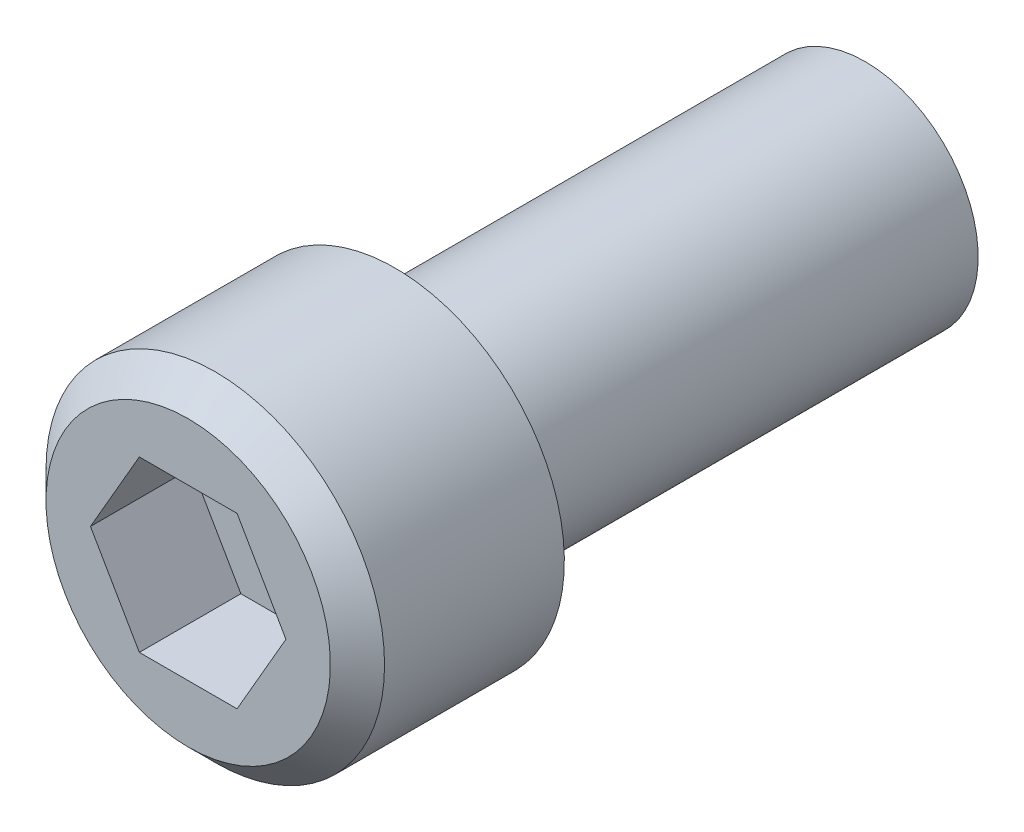
ISO-10303-21;
HEADER;
FILE_DESCRIPTION(('STEP AP214'),'2;1');
FILE_NAME('part.step','',(''),(''),'','','');
FILE_SCHEMA(('AUTOMOTIVE_DESIGN { 1 0 10303 214 1 1 1 1 }'));
ENDSEC;
DATA;
#1=APPLICATION_CONTEXT('core data for automotive mechanical design processes');
#2=APPLICATION_PROTOCOL_DEFINITION('international standard','automotive_design',2000,#1);
#3=PRODUCT_CONTEXT('',#1,'mechanical');
#4=PRODUCT('Part','Part','',(#3));
#5=PRODUCT_RELATED_PRODUCT_CATEGORY('part','',(#4));
#6=PRODUCT_DEFINITION_FORMATION('','',#4);
#7=PRODUCT_DEFINITION_CONTEXT('part definition',#1,'design');
#8=PRODUCT_DEFINITION('design','',#6,#7);
#9=PRODUCT_DEFINITION_SHAPE('','',#8);
#10=(LENGTH_UNIT() NAMED_UNIT(*) SI_UNIT(.MILLI.,.METRE.));
#11=(NAMED_UNIT(*) PLANE_ANGLE_UNIT() SI_UNIT($,.RADIAN.));
#12=(NAMED_UNIT(*) SI_UNIT($,.STERADIAN.) SOLID_ANGLE_UNIT());
#13=UNCERTAINTY_MEASURE_WITH_UNIT(LENGTH_MEASURE(1.E-05),#10,'distance_accuracy_value','');
#14=(GEOMETRIC_REPRESENTATION_CONTEXT(3) GLOBAL_UNCERTAINTY_ASSIGNED_CONTEXT((#13)) GLOBAL_UNIT_ASSIGNED_CONTEXT((#10,
#11,#12)) REPRESENTATION_CONTEXT('',''));
#15=CARTESIAN_POINT('',(0.,0.,0.));
#16=DIRECTION('',(0.,0.,1.));
#17=DIRECTION('',(1.,0.,0.));
#18=AXIS2_PLACEMENT_3D('',#15,#16,#17);
#19=CARTESIAN_POINT('',(0.,0.,0.));
#20=DIRECTION('',(0.,0.,-1.));
#21=DIRECTION('',(0.,1.,0.));
#22=AXIS2_PLACEMENT_3D('',#19,#20,#21);
#23=PLANE('',#22);
#24=DIRECTION('',(-0.5,0.866025403784438,0.));
#25=VECTOR('',#24,1.);
#26=CARTESIAN_POINT('',(2.59807621135332,0.,0.));
#27=LINE('',#26,#25);
#28=CARTESIAN_POINT('',(2.59807621135331,0.,0.));
#29=VERTEX_POINT('',#28);
#30=CARTESIAN_POINT('',(1.29903810567666,2.25,0.));
#31=VERTEX_POINT('',#30);
#32=EDGE_CURVE('E127',#29,#31,#27,.T.);
#33=ORIENTED_EDGE('',*,*,#32,.F.);
#34=DIRECTION('',(0.499999999999999,0.866025403784439,0.));
#35=VECTOR('',#34,1.);
#36=CARTESIAN_POINT('',(1.29903810567666,-2.25,0.));
#37=LINE('',#36,#35);
#38=CARTESIAN_POINT('',(1.29903810567666,-2.25,0.));
#39=VERTEX_POINT('',#38);
#40=EDGE_CURVE('E53',#39,#29,#37,.T.);
#41=ORIENTED_EDGE('',*,*,#40,.F.);
#42=DIRECTION('',(1.,0.,0.));
#43=VECTOR('',#42,1.);
#44=CARTESIAN_POINT('',(-1.29903810567666,-2.25,0.));
#45=LINE('',#44,#43);
#46=CARTESIAN_POINT('',(-1.29903810567666,-2.25,0.));
#47=VERTEX_POINT('',#46);
#48=EDGE_CURVE('E136',#47,#39,#45,.T.);
#49=ORIENTED_EDGE('',*,*,#48,.F.);
#50=DIRECTION('',(0.5,-0.866025403784438,0.));
#51=VECTOR('',#50,1.);
#52=CARTESIAN_POINT('',(-2.59807621135331,0.,0.));
#53=LINE('',#52,#51);
#54=CARTESIAN_POINT('',(-2.59807621135331,0.,0.));
#55=VERTEX_POINT('',#54);
#56=EDGE_CURVE('E134',#55,#47,#53,.T.);
#57=ORIENTED_EDGE('',*,*,#56,.F.);
#58=DIRECTION('',(-0.5,-0.866025403784439,0.));
#59=VECTOR('',#58,1.);
#60=CARTESIAN_POINT('',(-1.29903810567666,2.25,0.));
#61=LINE('',#60,#59);
#62=CARTESIAN_POINT('',(-1.29903810567666,2.25,0.));
#63=VERTEX_POINT('',#62);
#64=EDGE_CURVE('E101',#63,#55,#61,.T.);
#65=ORIENTED_EDGE('',*,*,#64,.F.);
#66=DIRECTION('',(-1.,0.,0.));
#67=VECTOR('',#66,1.);
#68=CARTESIAN_POINT('',(1.29903810567666,2.25,0.));
#69=LINE('',#68,#67);
#70=EDGE_CURVE('E130',#31,#63,#69,.T.);
#71=ORIENTED_EDGE('',*,*,#70,.F.);
#72=EDGE_LOOP('',(#33,#41,#49,#57,#65,#71));
#73=FACE_BOUND('',#72,.T.);
#74=CARTESIAN_POINT('',(0.,0.,0.));
#75=DIRECTION('',(0.,0.,-1.));
#76=DIRECTION('',(0.,1.,0.));
#77=AXIS2_PLACEMENT_3D('',#74,#75,#76);
#78=CIRCLE('',#77,3.78);
#79=CARTESIAN_POINT('',(0.,3.78,0.));
#80=VERTEX_POINT('',#79);
#81=EDGE_CURVE('E46',#80,#80,#78,.F.);
#82=ORIENTED_EDGE('',*,*,#81,.T.);
#83=EDGE_LOOP('',(#82));
#84=FACE_BOUND('',#83,.T.);
#85=ADVANCED_FACE('F38',(#73,#84),#23,.F.);
#86=CARTESIAN_POINT('',(0.,0.,0.));
#87=DIRECTION('',(0.,0.,1.));
#88=DIRECTION('',(0.,-1.,0.));
#89=AXIS2_PLACEMENT_3D('',#86,#87,#88);
#90=CYLINDRICAL_SURFACE('',#89,4.5);
#91=CARTESIAN_POINT('',(0.,0.,-0.720000000000005));
#92=DIRECTION('',(0.,0.,-1.));
#93=DIRECTION('',(0.,1.,0.));
#94=AXIS2_PLACEMENT_3D('',#91,#92,#93);
#95=CIRCLE('',#94,4.5);
#96=CARTESIAN_POINT('',(0.,4.5,-0.720000000000005));
#97=VERTEX_POINT('',#96);
#98=EDGE_CURVE('E11',#97,#97,#95,.T.);
#99=ORIENTED_EDGE('',*,*,#98,.T.);
#100=EDGE_LOOP('',(#99));
#101=FACE_BOUND('',#100,.T.);
#102=CARTESIAN_POINT('',(0.,0.,-5.5));
#103=DIRECTION('',(0.,0.,1.));
#104=DIRECTION('',(0.,-1.,0.));
#105=AXIS2_PLACEMENT_3D('',#102,#103,#104);
#106=CIRCLE('',#105,4.5);
#107=CARTESIAN_POINT('',(0.,-4.5,-5.5));
#108=VERTEX_POINT('',#107);
#109=EDGE_CURVE('E151',#108,#108,#106,.T.);
#110=ORIENTED_EDGE('',*,*,#109,.T.);
#111=EDGE_LOOP('',(#110));
#112=FACE_BOUND('',#111,.T.);
#113=ADVANCED_FACE('F172',(#101,#112),#90,.T.);
#114=CARTESIAN_POINT('',(0.,-4.5,-5.5));
#115=DIRECTION('',(0.,0.,1.));
#116=DIRECTION('',(0.,-1.,0.));
#117=AXIS2_PLACEMENT_3D('',#114,#115,#116);
#118=PLANE('',#117);
#119=ORIENTED_EDGE('',*,*,#109,.F.);
#120=EDGE_LOOP('',(#119));
#121=FACE_BOUND('',#120,.T.);
#122=CARTESIAN_POINT('',(0.,0.,-5.5));
#123=DIRECTION('',(0.,0.,1.));
#124=DIRECTION('',(0.,-1.,0.));
#125=AXIS2_PLACEMENT_3D('',#122,#123,#124);
#126=CIRCLE('',#125,3.);
#127=CARTESIAN_POINT('',(0.,-3.,-5.5));
#128=VERTEX_POINT('',#127);
#129=EDGE_CURVE('E148',#128,#128,#126,.T.);
#130=ORIENTED_EDGE('',*,*,#129,.T.);
#131=EDGE_LOOP('',(#130));
#132=FACE_BOUND('',#131,.T.);
#133=ADVANCED_FACE('F177',(#121,#132),#118,.F.);
#134=CARTESIAN_POINT('',(0.,0.,0.));
#135=DIRECTION('',(0.,0.,1.));
#136=DIRECTION('',(0.,-1.,0.));
#137=AXIS2_PLACEMENT_3D('',#134,#135,#136);
#138=CYLINDRICAL_SURFACE('',#137,3.);
#139=ORIENTED_EDGE('',*,*,#129,.F.);
#140=EDGE_LOOP('',(#139));
#141=FACE_BOUND('',#140,.T.);
#142=CARTESIAN_POINT('',(0.,0.,-18.));
#143=DIRECTION('',(0.,0.,1.));
#144=DIRECTION('',(0.,-1.,0.));
#145=AXIS2_PLACEMENT_3D('',#142,#143,#144);
#146=CIRCLE('',#145,3.);
#147=CARTESIAN_POINT('',(0.,-3.,-18.));
#148=VERTEX_POINT('',#147);
#149=EDGE_CURVE('E140',#148,#148,#146,.T.);
#150=ORIENTED_EDGE('',*,*,#149,.T.);
#151=EDGE_LOOP('',(#150));
#152=FACE_BOUND('',#151,.T.);
#153=ADVANCED_FACE('F167',(#141,#152),#138,.T.);
#154=CARTESIAN_POINT('',(0.,-3.,-18.));
#155=DIRECTION('',(0.,0.,1.));
#156=DIRECTION('',(0.,-1.,0.));
#157=AXIS2_PLACEMENT_3D('',#154,#155,#156);
#158=PLANE('',#157);
#159=ORIENTED_EDGE('',*,*,#149,.F.);
#160=EDGE_LOOP('',(#159));
#161=FACE_BOUND('',#160,.T.);
#162=ADVANCED_FACE('F159',(#161),#158,.F.);
#163=CARTESIAN_POINT('',(0.,0.,0.));
#164=DIRECTION('',(0.,0.,-1.));
#165=DIRECTION('',(0.,1.,0.));
#166=AXIS2_PLACEMENT_3D('',#163,#164,#165);
#167=CONICAL_SURFACE('',#166,3.78,0.785398163397446);
#168=CARTESIAN_POINT('',(0.,4.5,-0.720000000000005));
#169=CARTESIAN_POINT('',(0.,4.4925,-0.712500000000005));
#170=CARTESIAN_POINT('',(0.,4.485,-0.705000000000005));
#171=CARTESIAN_POINT('',(0.,4.47,-0.690000000000005));
#172=CARTESIAN_POINT('',(0.,4.4625,-0.682500000000005));
#173=CARTESIAN_POINT('',(0.,4.4475,-0.667500000000005));
#174=CARTESIAN_POINT('',(0.,4.44,-0.660000000000005));
#175=CARTESIAN_POINT('',(0.,4.425,-0.645000000000005));
#176=CARTESIAN_POINT('',(0.,4.4175,-0.637500000000005));
#177=CARTESIAN_POINT('',(0.,4.4025,-0.622500000000005));
#178=CARTESIAN_POINT('',(0.,4.395,-0.615000000000004));
#179=CARTESIAN_POINT('',(0.,4.38,-0.600000000000004));
#180=CARTESIAN_POINT('',(0.,4.3725,-0.592500000000004));
#181=CARTESIAN_POINT('',(0.,4.3575,-0.577500000000004));
#182=CARTESIAN_POINT('',(0.,4.35,-0.570000000000004));
#183=CARTESIAN_POINT('',(0.,4.335,-0.555000000000004));
#184=CARTESIAN_POINT('',(0.,4.3275,-0.547500000000004));
#185=CARTESIAN_POINT('',(0.,4.3125,-0.532500000000004));
#186=CARTESIAN_POINT('',(0.,4.305,-0.525000000000004));
#187=CARTESIAN_POINT('',(0.,4.29,-0.510000000000004));
#188=CARTESIAN_POINT('',(0.,4.2825,-0.502500000000004));
#189=CARTESIAN_POINT('',(0.,4.2675,-0.487500000000004));
#190=CARTESIAN_POINT('',(0.,4.26,-0.480000000000004));
#191=CARTESIAN_POINT('',(0.,4.245,-0.465000000000004));
#192=CARTESIAN_POINT('',(0.,4.2375,-0.457500000000003));
#193=CARTESIAN_POINT('',(0.,4.2225,-0.442500000000003));
#194=CARTESIAN_POINT('',(0.,4.215,-0.435000000000003));
#195=CARTESIAN_POINT('',(0.,4.2,-0.420000000000003));
#196=CARTESIAN_POINT('',(0.,4.1925,-0.412500000000003));
#197=CARTESIAN_POINT('',(0.,4.1775,-0.397500000000003));
#198=CARTESIAN_POINT('',(0.,4.17,-0.390000000000003));
#199=CARTESIAN_POINT('',(0.,4.155,-0.375000000000003));
#200=CARTESIAN_POINT('',(0.,4.1475,-0.367500000000003));
#201=CARTESIAN_POINT('',(0.,4.1325,-0.352500000000003));
#202=CARTESIAN_POINT('',(0.,4.125,-0.345000000000003));
#203=CARTESIAN_POINT('',(0.,4.11,-0.330000000000003));
#204=CARTESIAN_POINT('',(0.,4.1025,-0.322500000000002));
#205=CARTESIAN_POINT('',(0.,4.0875,-0.307500000000002));
#206=CARTESIAN_POINT('',(0.,4.08,-0.300000000000002));
#207=CARTESIAN_POINT('',(0.,4.065,-0.285000000000002));
#208=CARTESIAN_POINT('',(0.,4.0575,-0.277500000000002));
#209=CARTESIAN_POINT('',(0.,4.0425,-0.262500000000002));
#210=CARTESIAN_POINT('',(0.,4.035,-0.255000000000002));
#211=CARTESIAN_POINT('',(0.,4.02,-0.240000000000002));
#212=CARTESIAN_POINT('',(0.,4.01249999999999,-0.232500000000002));
#213=CARTESIAN_POINT('',(0.,3.9975,-0.217500000000002));
#214=CARTESIAN_POINT('',(0.,3.99,-0.210000000000002));
#215=CARTESIAN_POINT('',(0.,3.975,-0.195000000000002));
#216=CARTESIAN_POINT('',(0.,3.9675,-0.187500000000001));
#217=CARTESIAN_POINT('',(0.,3.9525,-0.172500000000001));
#218=CARTESIAN_POINT('',(0.,3.945,-0.165000000000001));
#219=CARTESIAN_POINT('',(0.,3.93,-0.150000000000001));
#220=CARTESIAN_POINT('',(0.,3.9225,-0.142500000000001));
#221=CARTESIAN_POINT('',(0.,3.9075,-0.127500000000001));
#222=CARTESIAN_POINT('',(0.,3.9,-0.120000000000001));
#223=CARTESIAN_POINT('',(0.,3.885,-0.105000000000001));
#224=CARTESIAN_POINT('',(0.,3.8775,-0.0975000000000008));
#225=CARTESIAN_POINT('',(0.,3.8625,-0.0825000000000007));
#226=CARTESIAN_POINT('',(0.,3.855,-0.0750000000000006));
#227=CARTESIAN_POINT('',(0.,3.84,-0.0600000000000005));
#228=CARTESIAN_POINT('',(0.,3.8325,-0.0525000000000004));
#229=CARTESIAN_POINT('',(0.,3.8175,-0.0375000000000003));
#230=CARTESIAN_POINT('',(0.,3.81,-0.0300000000000003));
#231=CARTESIAN_POINT('',(0.,3.795,-0.0150000000000003));
#232=CARTESIAN_POINT('',(0.,3.78749999999999,-0.00750000000000025));
#233=CARTESIAN_POINT('',(0.,3.78,0.));
#234=B_SPLINE_CURVE_WITH_KNOTS('',3,(#168,#169,#170,#171,#172,#173,#174,#175,#176,#177,#178,
#179,#180,#181,#182,#183,#184,#185,#186,#187,#188,#189,#190,#191,#192,#193,#194,#195,#196,#197,
#198,#199,#200,#201,#202,#203,#204,#205,#206,#207,#208,#209,#210,#211,#212,#213,#214,#215,#216,
#217,#218,#219,#220,#221,#222,#223,#224,#225,#226,#227,#228,#229,#230,#231,#232,#233),
.UNSPECIFIED.,.F.,.F.,(4,2,2,2,2,2,2,2,2,2,2,2,2,2,2,2,2,2,2,2,2,2,2,2,2,2,2,2,2,2,2,2,4),(0.,
0.0318198051533947,0.0636396103067894,0.0954594154601842,0.127279220613579,0.159099025766974,
0.190918830920369,0.222738636073764,0.254558441227158,0.286378246380553,0.318198051533948,
0.350017856687343,0.381837661840737,0.413657466994133,0.445477272147527,0.477297077300922,
0.509116882454317,0.540936687607712,0.572756492761106,0.604576297914501,0.636396103067896,
0.668215908221291,0.700035713374686,0.73185551852808,0.763675323681475,0.79549512883487,
0.827314933988264,0.859134739141659,0.890954544295054,0.922774349448449,0.954594154601843,
0.986413959755238,1.01823376490863),.UNSPECIFIED.);
#235=EDGE_CURVE('BSEAM40',#97,#80,#234,.T.);
#236=ORIENTED_EDGE('',*,*,#98,.F.);
#237=ORIENTED_EDGE('',*,*,#81,.F.);
#238=ORIENTED_EDGE('',*,*,#235,.T.);
#239=ORIENTED_EDGE('',*,*,#235,.F.);
#240=EDGE_LOOP('',(#236,#238,#237,#239));
#241=FACE_BOUND('',#240,.T.);
#242=ADVANCED_FACE('F40',(#241),#167,.T.);
#243=CARTESIAN_POINT('',(1.29903810567666,-2.25,-2.7));
#244=DIRECTION('',(0.866025403784439,-0.499999999999999,0.));
#245=DIRECTION('',(0.499999999999999,0.866025403784439,0.));
#246=AXIS2_PLACEMENT_3D('',#243,#244,#245);
#247=PLANE('',#246);
#248=ORIENTED_EDGE('',*,*,#40,.T.);
#249=DIRECTION('',(0.,0.,1.));
#250=VECTOR('',#249,1.);
#251=CARTESIAN_POINT('',(2.59807621135332,0.,-2.7));
#252=LINE('',#251,#250);
#253=CARTESIAN_POINT('',(2.59807621135332,0.,-2.7));
#254=VERTEX_POINT('',#253);
#255=EDGE_CURVE('E83',#254,#29,#252,.T.);
#256=ORIENTED_EDGE('',*,*,#255,.F.);
#257=DIRECTION('',(0.499999999999999,0.866025403784439,0.));
#258=VECTOR('',#257,1.);
#259=CARTESIAN_POINT('',(1.29903810567666,-2.25,-2.7));
#260=LINE('',#259,#258);
#261=CARTESIAN_POINT('',(1.29903810567666,-2.25,-2.7));
#262=VERTEX_POINT('',#261);
#263=EDGE_CURVE('E138',#262,#254,#260,.T.);
#264=ORIENTED_EDGE('',*,*,#263,.F.);
#265=DIRECTION('',(0.,0.,1.));
#266=VECTOR('',#265,1.);
#267=CARTESIAN_POINT('',(1.29903810567666,-2.25,-2.7));
#268=LINE('',#267,#266);
#269=EDGE_CURVE('E61',#262,#39,#268,.T.);
#270=ORIENTED_EDGE('',*,*,#269,.T.);
#271=EDGE_LOOP('',(#248,#256,#264,#270));
#272=FACE_BOUND('',#271,.T.);
#273=ADVANCED_FACE('F158',(#272),#247,.F.);
#274=CARTESIAN_POINT('',(-1.29903810567666,-2.25,-2.7));
#275=DIRECTION('',(0.,-1.,0.));
#276=DIRECTION('',(1.,0.,0.));
#277=AXIS2_PLACEMENT_3D('',#274,#275,#276);
#278=PLANE('',#277);
#279=ORIENTED_EDGE('',*,*,#48,.T.);
#280=ORIENTED_EDGE('',*,*,#269,.F.);
#281=DIRECTION('',(1.,0.,0.));
#282=VECTOR('',#281,1.);
#283=CARTESIAN_POINT('',(-1.29903810567666,-2.25,-2.7));
#284=LINE('',#283,#282);
#285=CARTESIAN_POINT('',(-1.29903810567666,-2.25,-2.7));
#286=VERTEX_POINT('',#285);
#287=EDGE_CURVE('E113',#286,#262,#284,.T.);
#288=ORIENTED_EDGE('',*,*,#287,.F.);
#289=DIRECTION('',(0.,0.,1.));
#290=VECTOR('',#289,1.);
#291=CARTESIAN_POINT('',(-1.29903810567666,-2.25,-2.7));
#292=LINE('',#291,#290);
#293=EDGE_CURVE('E105',#286,#47,#292,.T.);
#294=ORIENTED_EDGE('',*,*,#293,.T.);
#295=EDGE_LOOP('',(#279,#280,#288,#294));
#296=FACE_BOUND('',#295,.T.);
#297=ADVANCED_FACE('F165',(#296),#278,.F.);
#298=CARTESIAN_POINT('',(-2.59807621135331,0.,-2.7));
#299=DIRECTION('',(-0.866025403784438,-0.5,0.));
#300=DIRECTION('',(0.5,-0.866025403784438,0.));
#301=AXIS2_PLACEMENT_3D('',#298,#299,#300);
#302=PLANE('',#301);
#303=ORIENTED_EDGE('',*,*,#56,.T.);
#304=ORIENTED_EDGE('',*,*,#293,.F.);
#305=DIRECTION('',(0.5,-0.866025403784438,0.));
#306=VECTOR('',#305,1.);
#307=CARTESIAN_POINT('',(-2.59807621135331,0.,-2.7));
#308=LINE('',#307,#306);
#309=CARTESIAN_POINT('',(-2.59807621135331,0.,-2.7));
#310=VERTEX_POINT('',#309);
#311=EDGE_CURVE('E109',#310,#286,#308,.T.);
#312=ORIENTED_EDGE('',*,*,#311,.F.);
#313=DIRECTION('',(0.,0.,1.));
#314=VECTOR('',#313,1.);
#315=CARTESIAN_POINT('',(-2.59807621135331,0.,-2.7));
#316=LINE('',#315,#314);
#317=EDGE_CURVE('E94',#310,#55,#316,.T.);
#318=ORIENTED_EDGE('',*,*,#317,.T.);
#319=EDGE_LOOP('',(#303,#304,#312,#318));
#320=FACE_BOUND('',#319,.T.);
#321=ADVANCED_FACE('F110',(#320),#302,.F.);
#322=CARTESIAN_POINT('',(-1.29903810567666,2.25,-2.7));
#323=DIRECTION('',(-0.866025403784439,0.5,0.));
#324=DIRECTION('',(-0.5,-0.866025403784439,0.));
#325=AXIS2_PLACEMENT_3D('',#322,#323,#324);
#326=PLANE('',#325);
#327=ORIENTED_EDGE('',*,*,#64,.T.);
#328=ORIENTED_EDGE('',*,*,#317,.F.);
#329=DIRECTION('',(-0.5,-0.866025403784439,0.));
#330=VECTOR('',#329,1.);
#331=CARTESIAN_POINT('',(-1.29903810567666,2.25,-2.7));
#332=LINE('',#331,#330);
#333=CARTESIAN_POINT('',(-1.29903810567666,2.25,-2.7));
#334=VERTEX_POINT('',#333);
#335=EDGE_CURVE('E98',#334,#310,#332,.T.);
#336=ORIENTED_EDGE('',*,*,#335,.F.);
#337=DIRECTION('',(0.,0.,1.));
#338=VECTOR('',#337,1.);
#339=CARTESIAN_POINT('',(-1.29903810567666,2.25,-2.7));
#340=LINE('',#339,#338);
#341=EDGE_CURVE('E106',#334,#63,#340,.T.);
#342=ORIENTED_EDGE('',*,*,#341,.T.);
#343=EDGE_LOOP('',(#327,#328,#336,#342));
#344=FACE_BOUND('',#343,.T.);
#345=ADVANCED_FACE('F96',(#344),#326,.F.);
#346=CARTESIAN_POINT('',(1.29903810567666,2.25,-2.7));
#347=DIRECTION('',(0.,1.,0.));
#348=DIRECTION('',(0.,0.,1.));
#349=AXIS2_PLACEMENT_3D('',#346,#347,#348);
#350=PLANE('',#349);
#351=ORIENTED_EDGE('',*,*,#70,.T.);
#352=ORIENTED_EDGE('',*,*,#341,.F.);
#353=DIRECTION('',(-1.,0.,0.));
#354=VECTOR('',#353,1.);
#355=CARTESIAN_POINT('',(1.29903810567666,2.25,-2.7));
#356=LINE('',#355,#354);
#357=CARTESIAN_POINT('',(1.29903810567666,2.25,-2.7));
#358=VERTEX_POINT('',#357);
#359=EDGE_CURVE('E119',#358,#334,#356,.T.);
#360=ORIENTED_EDGE('',*,*,#359,.F.);
#361=DIRECTION('',(0.,0.,1.));
#362=VECTOR('',#361,1.);
#363=CARTESIAN_POINT('',(1.29903810567666,2.25,-2.7));
#364=LINE('',#363,#362);
#365=EDGE_CURVE('E143',#358,#31,#364,.T.);
#366=ORIENTED_EDGE('',*,*,#365,.T.);
#367=EDGE_LOOP('',(#351,#352,#360,#366));
#368=FACE_BOUND('',#367,.T.);
#369=ADVANCED_FACE('F191',(#368),#350,.F.);
#370=CARTESIAN_POINT('',(2.59807621135332,0.,-2.7));
#371=DIRECTION('',(0.866025403784438,0.5,0.));
#372=DIRECTION('',(-0.5,0.866025403784438,0.));
#373=AXIS2_PLACEMENT_3D('',#370,#371,#372);
#374=PLANE('',#373);
#375=ORIENTED_EDGE('',*,*,#32,.T.);
#376=ORIENTED_EDGE('',*,*,#365,.F.);
#377=DIRECTION('',(-0.5,0.866025403784438,0.));
#378=VECTOR('',#377,1.);
#379=CARTESIAN_POINT('',(2.59807621135332,0.,-2.7));
#380=LINE('',#379,#378);
#381=EDGE_CURVE('E121',#254,#358,#380,.T.);
#382=ORIENTED_EDGE('',*,*,#381,.F.);
#383=ORIENTED_EDGE('',*,*,#255,.T.);
#384=EDGE_LOOP('',(#375,#376,#382,#383));
#385=FACE_BOUND('',#384,.T.);
#386=ADVANCED_FACE('F188',(#385),#374,.F.);
#387=CARTESIAN_POINT('',(2.59807621135331,0.,-2.7));
#388=DIRECTION('',(0.,0.,1.));
#389=DIRECTION('',(1.,0.,0.));
#390=AXIS2_PLACEMENT_3D('',#387,#388,#389);
#391=PLANE('',#390);
#392=ORIENTED_EDGE('',*,*,#263,.T.);
#393=ORIENTED_EDGE('',*,*,#381,.T.);
#394=ORIENTED_EDGE('',*,*,#359,.T.);
#395=ORIENTED_EDGE('',*,*,#335,.T.);
#396=ORIENTED_EDGE('',*,*,#311,.T.);
#397=ORIENTED_EDGE('',*,*,#287,.T.);
#398=EDGE_LOOP('',(#392,#393,#394,#395,#396,#397));
#399=FACE_BOUND('',#398,.T.);
#400=ADVANCED_FACE('F116',(#399),#391,.T.);
#401=CLOSED_SHELL('',(#85,#113,#133,#153,#162,#242,#273,#297,#321,#345,#369,#386,#400));
#402=MANIFOLD_SOLID_BREP('B2',#401);
#403=ADVANCED_BREP_SHAPE_REPRESENTATION('',(#18,#402),#14);
#404=SHAPE_DEFINITION_REPRESENTATION(#9,#403);
ENDSEC;
END-ISO-10303-21;
